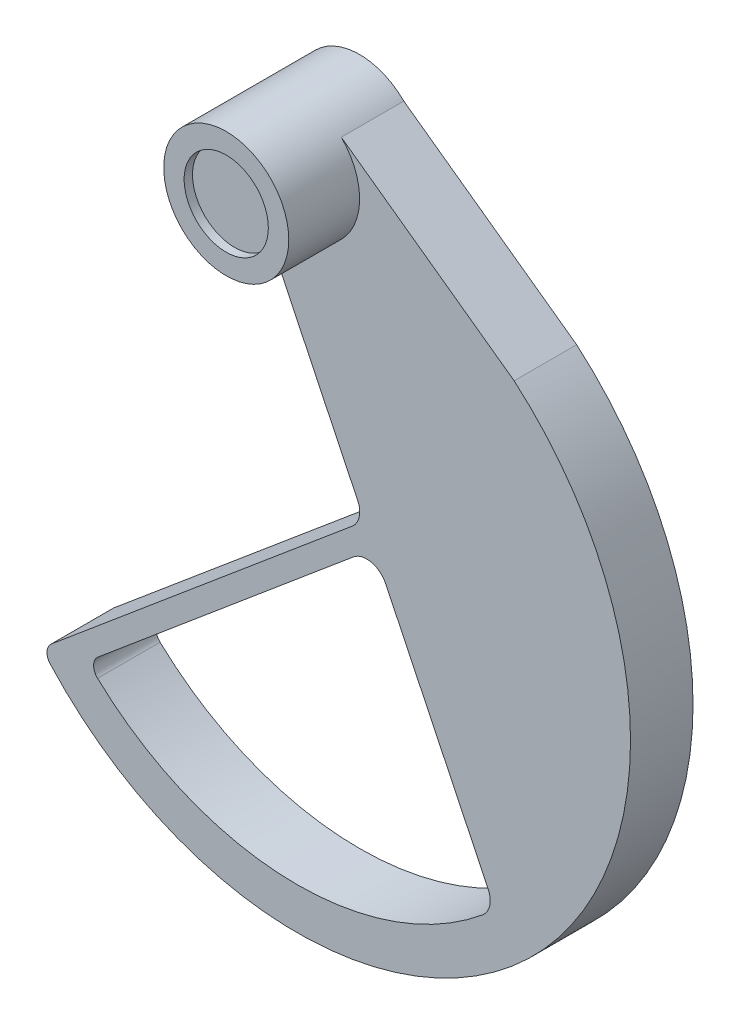
ISO-10303-21;
HEADER;
FILE_DESCRIPTION(('STEP AP214'),'2;1');
FILE_NAME('part.step','',(''),(''),'','','');
FILE_SCHEMA(('AUTOMOTIVE_DESIGN { 1 0 10303 214 1 1 1 1 }'));
ENDSEC;
DATA;
#1=APPLICATION_CONTEXT('core data for automotive mechanical design processes');
#2=APPLICATION_PROTOCOL_DEFINITION('international standard','automotive_design',2000,#1);
#3=PRODUCT_CONTEXT('',#1,'mechanical');
#4=PRODUCT('Part','Part','',(#3));
#5=PRODUCT_RELATED_PRODUCT_CATEGORY('part','',(#4));
#6=PRODUCT_DEFINITION_FORMATION('','',#4);
#7=PRODUCT_DEFINITION_CONTEXT('part definition',#1,'design');
#8=PRODUCT_DEFINITION('design','',#6,#7);
#9=PRODUCT_DEFINITION_SHAPE('','',#8);
#10=(LENGTH_UNIT() NAMED_UNIT(*) SI_UNIT(.MILLI.,.METRE.));
#11=(NAMED_UNIT(*) PLANE_ANGLE_UNIT() SI_UNIT($,.RADIAN.));
#12=(NAMED_UNIT(*) SI_UNIT($,.STERADIAN.) SOLID_ANGLE_UNIT());
#13=UNCERTAINTY_MEASURE_WITH_UNIT(LENGTH_MEASURE(1.E-05),#10,'distance_accuracy_value','');
#14=(GEOMETRIC_REPRESENTATION_CONTEXT(3) GLOBAL_UNCERTAINTY_ASSIGNED_CONTEXT((#13)) GLOBAL_UNIT_ASSIGNED_CONTEXT((#10,
#11,#12)) REPRESENTATION_CONTEXT('',''));
#15=CARTESIAN_POINT('',(0.,0.,0.));
#16=DIRECTION('',(0.,0.,1.));
#17=DIRECTION('',(1.,0.,0.));
#18=AXIS2_PLACEMENT_3D('',#15,#16,#17);
#19=CARTESIAN_POINT('',(-12.7570586950624,-6.1348621133076,15.));
#20=DIRECTION('',(0.901206602628173,0.433389731511241,0.));
#21=DIRECTION('',(-0.433389731511241,0.901206602628173,0.));
#22=AXIS2_PLACEMENT_3D('',#19,#20,#21);
#23=PLANE('',#22);
#24=DIRECTION('',(0.433389731511241,-0.901206602628173,0.));
#25=VECTOR('',#24,1.);
#26=CARTESIAN_POINT('',(-12.7570586950624,-6.1348621133076,0.));
#27=LINE('',#26,#25);
#28=CARTESIAN_POINT('',(21.2324006956412,-76.8137984043253,0.));
#29=VERTEX_POINT('',#28);
#30=CARTESIAN_POINT('',(45.844843506453,-127.9938203457,0.));
#31=VERTEX_POINT('',#30);
#32=EDGE_CURVE('E185',#29,#31,#27,.T.);
#33=ORIENTED_EDGE('',*,*,#32,.T.);
#34=DIRECTION('',(0.,0.,-1.));
#35=VECTOR('',#34,1.);
#36=CARTESIAN_POINT('',(45.844843506453,-127.9938203457,15.));
#37=LINE('',#36,#35);
#38=CARTESIAN_POINT('',(45.844843506453,-127.9938203457,15.));
#39=VERTEX_POINT('',#38);
#40=EDGE_CURVE('E45',#39,#31,#37,.T.);
#41=ORIENTED_EDGE('',*,*,#40,.F.);
#42=DIRECTION('',(0.433389731511241,-0.901206602628173,0.));
#43=VECTOR('',#42,1.);
#44=CARTESIAN_POINT('',(-12.7570586950624,-6.1348621133076,15.));
#45=LINE('',#44,#43);
#46=CARTESIAN_POINT('',(21.2324006956412,-76.8137984043253,15.));
#47=VERTEX_POINT('',#46);
#48=EDGE_CURVE('E228',#47,#39,#45,.T.);
#49=ORIENTED_EDGE('',*,*,#48,.F.);
#50=DIRECTION('',(0.,0.,-1.));
#51=VECTOR('',#50,1.);
#52=CARTESIAN_POINT('',(21.2324006956412,-76.8137984043253,15.));
#53=LINE('',#52,#51);
#54=EDGE_CURVE('E198',#47,#29,#53,.T.);
#55=ORIENTED_EDGE('',*,*,#54,.T.);
#56=EDGE_LOOP('',(#33,#41,#49,#55));
#57=FACE_BOUND('',#56,.T.);
#58=ADVANCED_FACE('F35',(#57),#23,.F.);
#59=CARTESIAN_POINT('',(41.3388104933121,-130.160769003256,15.));
#60=DIRECTION('',(0.,0.,-1.));
#61=DIRECTION('',(-1.,0.,0.));
#62=AXIS2_PLACEMENT_3D('',#59,#60,#61);
#63=CYLINDRICAL_SURFACE('',#62,4.99999999999999);
#64=CARTESIAN_POINT('',(41.3388104933121,-130.160769003256,0.));
#65=DIRECTION('',(0.,0.,1.));
#66=DIRECTION('',(1.,0.,0.));
#67=AXIS2_PLACEMENT_3D('',#64,#65,#66);
#68=CIRCLE('',#67,4.99999999999999);
#69=CARTESIAN_POINT('',(44.5187189927976,-134.019289695814,0.));
#70=VERTEX_POINT('',#69);
#71=EDGE_CURVE('E188',#31,#70,#68,.F.);
#72=ORIENTED_EDGE('',*,*,#71,.T.);
#73=DIRECTION('',(0.,0.,-1.));
#74=VECTOR('',#73,1.);
#75=CARTESIAN_POINT('',(44.5187189927976,-134.019289695814,15.));
#76=LINE('',#75,#74);
#77=CARTESIAN_POINT('',(44.5187189927976,-134.019289695814,15.));
#78=VERTEX_POINT('',#77);
#79=EDGE_CURVE('E202',#78,#70,#76,.T.);
#80=ORIENTED_EDGE('',*,*,#79,.F.);
#81=CARTESIAN_POINT('',(41.3388104933121,-130.160769003256,15.));
#82=DIRECTION('',(0.,0.,1.));
#83=DIRECTION('',(1.,0.,0.));
#84=AXIS2_PLACEMENT_3D('',#81,#82,#83);
#85=CIRCLE('',#84,4.99999999999999);
#86=EDGE_CURVE('E232',#39,#78,#85,.F.);
#87=ORIENTED_EDGE('',*,*,#86,.F.);
#88=ORIENTED_EDGE('',*,*,#40,.T.);
#89=EDGE_LOOP('',(#72,#80,#87,#88));
#90=FACE_BOUND('',#89,.T.);
#91=ADVANCED_FACE('F274',(#90),#63,.F.);
#92=CARTESIAN_POINT('',(0.,-80.,15.));
#93=DIRECTION('',(0.,0.,-1.));
#94=DIRECTION('',(-1.,0.,0.));
#95=AXIS2_PLACEMENT_3D('',#92,#93,#94);
#96=CYLINDRICAL_SURFACE('',#95,70.);
#97=CARTESIAN_POINT('',(0.,-80.,0.));
#98=DIRECTION('',(0.,0.,1.));
#99=DIRECTION('',(1.,0.,0.));
#100=AXIS2_PLACEMENT_3D('',#97,#98,#99);
#101=CIRCLE('',#100,70.);
#102=CARTESIAN_POINT('',(-47.870174388264,-131.072951785042,0.));
#103=VERTEX_POINT('',#102);
#104=EDGE_CURVE('E191',#103,#70,#101,.T.);
#105=ORIENTED_EDGE('',*,*,#104,.F.);
#106=DIRECTION('',(0.,0.,-1.));
#107=VECTOR('',#106,1.);
#108=CARTESIAN_POINT('',(-47.870174388264,-131.072951785042,15.));
#109=LINE('',#108,#107);
#110=CARTESIAN_POINT('',(-47.870174388264,-131.072951785042,15.));
#111=VERTEX_POINT('',#110);
#112=EDGE_CURVE('E155',#111,#103,#109,.T.);
#113=ORIENTED_EDGE('',*,*,#112,.F.);
#114=CARTESIAN_POINT('',(0.,-80.,15.));
#115=DIRECTION('',(0.,0.,1.));
#116=DIRECTION('',(1.,0.,0.));
#117=AXIS2_PLACEMENT_3D('',#114,#115,#116);
#118=CIRCLE('',#117,70.);
#119=EDGE_CURVE('E148',#111,#78,#118,.T.);
#120=ORIENTED_EDGE('',*,*,#119,.T.);
#121=ORIENTED_EDGE('',*,*,#79,.T.);
#122=EDGE_LOOP('',(#105,#113,#120,#121));
#123=FACE_BOUND('',#122,.T.);
#124=ADVANCED_FACE('F251',(#123),#96,.F.);
#125=CARTESIAN_POINT('',(-45.8185954859101,-128.884110994254,15.));
#126=DIRECTION('',(0.,0.,-1.));
#127=DIRECTION('',(-1.,0.,0.));
#128=AXIS2_PLACEMENT_3D('',#125,#126,#127);
#129=CYLINDRICAL_SURFACE('',#128,2.99999999999979);
#130=CARTESIAN_POINT('',(-45.8185954859101,-128.884110994254,0.));
#131=DIRECTION('',(0.,0.,1.));
#132=DIRECTION('',(1.,0.,0.));
#133=AXIS2_PLACEMENT_3D('',#130,#131,#132);
#134=CIRCLE('',#133,2.99999999999979);
#135=CARTESIAN_POINT('',(-47.7476784165524,-126.586582094174,0.));
#136=VERTEX_POINT('',#135);
#137=EDGE_CURVE('E154',#103,#136,#134,.F.);
#138=ORIENTED_EDGE('',*,*,#137,.T.);
#139=DIRECTION('',(0.,0.,-1.));
#140=VECTOR('',#139,1.);
#141=CARTESIAN_POINT('',(-47.7476784165524,-126.586582094174,15.));
#142=LINE('',#141,#140);
#143=CARTESIAN_POINT('',(-47.7476784165524,-126.586582094174,15.));
#144=VERTEX_POINT('',#143);
#145=EDGE_CURVE('E151',#144,#136,#142,.T.);
#146=ORIENTED_EDGE('',*,*,#145,.F.);
#147=CARTESIAN_POINT('',(-45.8185954859101,-128.884110994254,15.));
#148=DIRECTION('',(0.,0.,1.));
#149=DIRECTION('',(1.,0.,0.));
#150=AXIS2_PLACEMENT_3D('',#147,#148,#149);
#151=CIRCLE('',#150,2.99999999999979);
#152=EDGE_CURVE('E142',#111,#144,#151,.F.);
#153=ORIENTED_EDGE('',*,*,#152,.F.);
#154=ORIENTED_EDGE('',*,*,#112,.T.);
#155=EDGE_LOOP('',(#138,#146,#153,#154));
#156=FACE_BOUND('',#155,.T.);
#157=ADVANCED_FACE('F152',(#156),#129,.F.);
#158=CARTESIAN_POINT('',(42.5956727933285,-50.7312504333006,15.));
#159=DIRECTION('',(-0.643027643547508,0.765842966693394,0.));
#160=DIRECTION('',(-0.765842966693394,-0.643027643547508,0.));
#161=AXIS2_PLACEMENT_3D('',#158,#159,#160);
#162=PLANE('',#161);
#163=DIRECTION('',(0.765842966693394,0.643027643547508,0.));
#164=VECTOR('',#163,1.);
#165=CARTESIAN_POINT('',(42.5956727933285,-50.7312504333006,0.));
#166=LINE('',#165,#164);
#167=CARTESIAN_POINT('',(13.5112294647628,-75.1515322284145,0.));
#168=VERTEX_POINT('',#167);
#169=EDGE_CURVE('E99',#136,#168,#166,.T.);
#170=ORIENTED_EDGE('',*,*,#169,.T.);
#171=DIRECTION('',(0.,0.,-1.));
#172=VECTOR('',#171,1.);
#173=CARTESIAN_POINT('',(13.5112294647628,-75.1515322284145,15.));
#174=LINE('',#173,#172);
#175=CARTESIAN_POINT('',(13.5112294647628,-75.1515322284145,15.));
#176=VERTEX_POINT('',#175);
#177=EDGE_CURVE('E156',#176,#168,#174,.T.);
#178=ORIENTED_EDGE('',*,*,#177,.F.);
#179=DIRECTION('',(0.765842966693394,0.643027643547508,0.));
#180=VECTOR('',#179,1.);
#181=CARTESIAN_POINT('',(42.5956727933285,-50.7312504333006,15.));
#182=LINE('',#181,#180);
#183=EDGE_CURVE('E146',#144,#176,#182,.T.);
#184=ORIENTED_EDGE('',*,*,#183,.F.);
#185=ORIENTED_EDGE('',*,*,#145,.T.);
#186=EDGE_LOOP('',(#170,#178,#184,#185));
#187=FACE_BOUND('',#186,.T.);
#188=ADVANCED_FACE('F158',(#187),#162,.F.);
#189=CARTESIAN_POINT('',(10.0302471408598,-65.0565868768263,15.));
#190=DIRECTION('',(0.,0.,-1.));
#191=DIRECTION('',(-1.,0.,0.));
#192=AXIS2_PLACEMENT_3D('',#189,#190,#191);
#193=CYLINDRICAL_SURFACE('',#192,5.);
#194=CARTESIAN_POINT('',(10.0302471408598,-65.0565868768263,0.));
#195=DIRECTION('',(0.,0.,1.));
#196=DIRECTION('',(1.,0.,0.));
#197=AXIS2_PLACEMENT_3D('',#194,#195,#196);
#198=CIRCLE('',#197,5.);
#199=CARTESIAN_POINT('',(13.2441851892925,-68.8868090924212,0.));
#200=VERTEX_POINT('',#199);
#201=CARTESIAN_POINT('',(14.5362801540007,-62.8896382192701,0.));
#202=VERTEX_POINT('',#201);
#203=EDGE_CURVE('E164',#200,#202,#198,.T.);
#204=ORIENTED_EDGE('',*,*,#203,.F.);
#205=DIRECTION('',(0.,0.,-1.));
#206=VECTOR('',#205,1.);
#207=CARTESIAN_POINT('',(13.2441851892925,-68.8868090924212,15.));
#208=LINE('',#207,#206);
#209=CARTESIAN_POINT('',(13.2441851892925,-68.8868090924212,15.));
#210=VERTEX_POINT('',#209);
#211=EDGE_CURVE('E113',#210,#200,#208,.T.);
#212=ORIENTED_EDGE('',*,*,#211,.F.);
#213=CARTESIAN_POINT('',(10.0302471408598,-65.0565868768263,15.));
#214=DIRECTION('',(0.,0.,1.));
#215=DIRECTION('',(1.,0.,0.));
#216=AXIS2_PLACEMENT_3D('',#213,#214,#215);
#217=CIRCLE('',#216,5.);
#218=CARTESIAN_POINT('',(14.5362801540007,-62.8896382192701,15.));
#219=VERTEX_POINT('',#218);
#220=EDGE_CURVE('E197',#210,#219,#217,.T.);
#221=ORIENTED_EDGE('',*,*,#220,.T.);
#222=DIRECTION('',(0.,0.,-1.));
#223=VECTOR('',#222,1.);
#224=CARTESIAN_POINT('',(14.5362801540007,-62.8896382192701,15.));
#225=LINE('',#224,#223);
#226=EDGE_CURVE('E160',#219,#202,#225,.T.);
#227=ORIENTED_EDGE('',*,*,#226,.T.);
#228=EDGE_LOOP('',(#204,#212,#221,#227));
#229=FACE_BOUND('',#228,.T.);
#230=ADVANCED_FACE('F37',(#229),#193,.F.);
#231=CARTESIAN_POINT('',(39.3923101204882,-46.9459271066778,15.));
#232=DIRECTION('',(-0.642787609686534,0.766044443118983,0.));
#233=DIRECTION('',(-0.766044443118982,-0.642787609686534,0.));
#234=AXIS2_PLACEMENT_3D('',#231,#232,#233);
#235=PLANE('',#234);
#236=DIRECTION('',(0.766044443118982,0.642787609686534,0.));
#237=VECTOR('',#236,1.);
#238=CARTESIAN_POINT('',(39.3923101204882,-46.9459271066778,0.));
#239=LINE('',#238,#237);
#240=CARTESIAN_POINT('',(-58.9406362868111,-129.457066169617,0.));
#241=VERTEX_POINT('',#240);
#242=EDGE_CURVE('E167',#241,#200,#239,.T.);
#243=ORIENTED_EDGE('',*,*,#242,.F.);
#244=DIRECTION('',(0.,0.,-1.));
#245=VECTOR('',#244,1.);
#246=CARTESIAN_POINT('',(-58.9406362868111,-129.457066169617,15.));
#247=LINE('',#246,#245);
#248=CARTESIAN_POINT('',(-58.9406362868111,-129.457066169617,15.));
#249=VERTEX_POINT('',#248);
#250=EDGE_CURVE('E213',#249,#241,#247,.T.);
#251=ORIENTED_EDGE('',*,*,#250,.F.);
#252=DIRECTION('',(0.766044443118982,0.642787609686534,0.));
#253=VECTOR('',#252,1.);
#254=CARTESIAN_POINT('',(39.3923101204882,-46.9459271066778,15.));
#255=LINE('',#254,#253);
#256=EDGE_CURVE('E245',#249,#210,#255,.T.);
#257=ORIENTED_EDGE('',*,*,#256,.T.);
#258=ORIENTED_EDGE('',*,*,#211,.T.);
#259=EDGE_LOOP('',(#243,#251,#257,#258));
#260=FACE_BOUND('',#259,.T.);
#261=ADVANCED_FACE('F295',(#260),#235,.T.);
#262=CARTESIAN_POINT('',(-57.0122734577518,-131.755199498973,15.));
#263=DIRECTION('',(0.,0.,-1.));
#264=DIRECTION('',(-1.,0.,0.));
#265=AXIS2_PLACEMENT_3D('',#262,#263,#264);
#266=CYLINDRICAL_SURFACE('',#265,2.99999999999976);
#267=CARTESIAN_POINT('',(-57.0122734577518,-131.755199498973,0.));
#268=DIRECTION('',(0.,0.,1.));
#269=DIRECTION('',(1.,0.,0.));
#270=AXIS2_PLACEMENT_3D('',#267,#268,#269);
#271=CIRCLE('',#270,2.99999999999976);
#272=CARTESIAN_POINT('',(-59.2335308651964,-133.771635843089,0.));
#273=VERTEX_POINT('',#272);
#274=EDGE_CURVE('E171',#273,#241,#271,.F.);
#275=ORIENTED_EDGE('',*,*,#274,.F.);
#276=DIRECTION('',(0.,0.,-1.));
#277=VECTOR('',#276,1.);
#278=CARTESIAN_POINT('',(-59.2335308651964,-133.771635843089,15.));
#279=LINE('',#278,#277);
#280=CARTESIAN_POINT('',(-59.2335308651964,-133.771635843089,15.));
#281=VERTEX_POINT('',#280);
#282=EDGE_CURVE('E210',#281,#273,#279,.T.);
#283=ORIENTED_EDGE('',*,*,#282,.F.);
#284=CARTESIAN_POINT('',(-57.0122734577518,-131.755199498973,15.));
#285=DIRECTION('',(0.,0.,1.));
#286=DIRECTION('',(1.,0.,0.));
#287=AXIS2_PLACEMENT_3D('',#284,#285,#286);
#288=CIRCLE('',#287,2.99999999999976);
#289=EDGE_CURVE('E239',#281,#249,#288,.F.);
#290=ORIENTED_EDGE('',*,*,#289,.T.);
#291=ORIENTED_EDGE('',*,*,#250,.T.);
#292=EDGE_LOOP('',(#275,#283,#290,#291));
#293=FACE_BOUND('',#292,.T.);
#294=ADVANCED_FACE('F292',(#293),#266,.T.);
#295=CARTESIAN_POINT('',(0.,-80.,15.));
#296=DIRECTION('',(0.,0.,-1.));
#297=DIRECTION('',(-1.,0.,0.));
#298=AXIS2_PLACEMENT_3D('',#295,#296,#297);
#299=CYLINDRICAL_SURFACE('',#298,80.);
#300=CARTESIAN_POINT('',(0.,-80.,0.));
#301=DIRECTION('',(0.,0.,1.));
#302=DIRECTION('',(1.,0.,0.));
#303=AXIS2_PLACEMENT_3D('',#300,#301,#302);
#304=CIRCLE('',#303,80.);
#305=CARTESIAN_POINT('',(52.0761789176771,-19.2705047828151,0.));
#306=VERTEX_POINT('',#305);
#307=EDGE_CURVE('E174',#273,#306,#304,.T.);
#308=ORIENTED_EDGE('',*,*,#307,.T.);
#309=DIRECTION('',(0.,0.,-1.));
#310=VECTOR('',#309,1.);
#311=CARTESIAN_POINT('',(52.0761789176771,-19.2705047828151,15.));
#312=LINE('',#311,#310);
#313=CARTESIAN_POINT('',(52.0761789176771,-19.2705047828151,15.));
#314=VERTEX_POINT('',#313);
#315=EDGE_CURVE('E208',#314,#306,#312,.T.);
#316=ORIENTED_EDGE('',*,*,#315,.F.);
#317=CARTESIAN_POINT('',(0.,-80.,15.));
#318=DIRECTION('',(0.,0.,1.));
#319=DIRECTION('',(1.,0.,0.));
#320=AXIS2_PLACEMENT_3D('',#317,#318,#319);
#321=CIRCLE('',#320,80.);
#322=EDGE_CURVE('E235',#281,#314,#321,.T.);
#323=ORIENTED_EDGE('',*,*,#322,.F.);
#324=ORIENTED_EDGE('',*,*,#282,.T.);
#325=EDGE_LOOP('',(#308,#316,#323,#324));
#326=FACE_BOUND('',#325,.T.);
#327=ADVANCED_FACE('F289',(#326),#299,.T.);
#328=CARTESIAN_POINT('',(8.65474635415258,12.0128323695447,15.));
#329=DIRECTION('',(0.584549661802916,0.811357931424902,0.));
#330=DIRECTION('',(-0.811357931424902,0.584549661802916,0.));
#331=AXIS2_PLACEMENT_3D('',#328,#329,#330);
#332=PLANE('',#331);
#333=DIRECTION('',(0.811357931424902,-0.584549661802916,0.));
#334=VECTOR('',#333,1.);
#335=CARTESIAN_POINT('',(8.65474635415258,12.0128323695447,0.));
#336=LINE('',#335,#334);
#337=CARTESIAN_POINT('',(10.6066017177981,10.6066017177983,0.));
#338=VERTEX_POINT('',#337);
#339=EDGE_CURVE('E177',#338,#306,#336,.T.);
#340=ORIENTED_EDGE('',*,*,#339,.F.);
#341=DIRECTION('',(0.,0.,-1.));
#342=VECTOR('',#341,1.);
#343=CARTESIAN_POINT('',(10.6066017177981,10.6066017177983,15.));
#344=LINE('',#343,#342);
#345=CARTESIAN_POINT('',(10.6066017177981,10.6066017177983,15.));
#346=VERTEX_POINT('',#345);
#347=EDGE_CURVE('E211',#346,#338,#344,.T.);
#348=ORIENTED_EDGE('',*,*,#347,.F.);
#349=DIRECTION('',(0.811357931424902,-0.584549661802916,0.));
#350=VECTOR('',#349,1.);
#351=CARTESIAN_POINT('',(8.65474635415258,12.0128323695447,15.));
#352=LINE('',#351,#350);
#353=EDGE_CURVE('E218',#346,#314,#352,.T.);
#354=ORIENTED_EDGE('',*,*,#353,.T.);
#355=ORIENTED_EDGE('',*,*,#315,.T.);
#356=EDGE_LOOP('',(#340,#348,#354,#355));
#357=FACE_BOUND('',#356,.T.);
#358=ADVANCED_FACE('F285',(#357),#332,.T.);
#359=CARTESIAN_POINT('',(0.,0.,15.));
#360=DIRECTION('',(0.,0.,-1.));
#361=DIRECTION('',(-1.,0.,0.));
#362=AXIS2_PLACEMENT_3D('',#359,#360,#361);
#363=CYLINDRICAL_SURFACE('',#362,15.);
#364=CARTESIAN_POINT('',(0.,0.,0.));
#365=DIRECTION('',(0.,0.,1.));
#366=DIRECTION('',(1.,0.,0.));
#367=AXIS2_PLACEMENT_3D('',#364,#365,#366);
#368=CIRCLE('',#367,15.);
#369=CARTESIAN_POINT('',(-10.6066017177981,-10.6066017177983,0.));
#370=VERTEX_POINT('',#369);
#371=EDGE_CURVE('E180',#338,#370,#368,.T.);
#372=ORIENTED_EDGE('',*,*,#371,.T.);
#373=DIRECTION('',(0.,0.,-1.));
#374=VECTOR('',#373,1.);
#375=CARTESIAN_POINT('',(-10.6066017177981,-10.6066017177983,15.));
#376=LINE('',#375,#374);
#377=CARTESIAN_POINT('',(-10.6066017177981,-10.6066017177983,15.));
#378=VERTEX_POINT('',#377);
#379=EDGE_CURVE('E207',#378,#370,#376,.T.);
#380=ORIENTED_EDGE('',*,*,#379,.F.);
#381=CARTESIAN_POINT('',(0.,0.,15.));
#382=DIRECTION('',(0.,0.,1.));
#383=DIRECTION('',(1.,0.,0.));
#384=AXIS2_PLACEMENT_3D('',#381,#382,#383);
#385=CIRCLE('',#384,15.);
#386=EDGE_CURVE('E11',#378,#346,#385,.T.);
#387=ORIENTED_EDGE('',*,*,#386,.T.);
#388=ORIENTED_EDGE('',*,*,#347,.T.);
#389=EDGE_LOOP('',(#372,#380,#387,#388));
#390=FACE_BOUND('',#389,.T.);
#391=CARTESIAN_POINT('',(0.,0.,32.));
#392=DIRECTION('',(0.,0.,1.));
#393=DIRECTION('',(1.,0.,0.));
#394=AXIS2_PLACEMENT_3D('',#391,#392,#393);
#395=CIRCLE('',#394,15.);
#396=CARTESIAN_POINT('',(15.,0.,32.));
#397=VERTEX_POINT('',#396);
#398=EDGE_CURVE('E168',#397,#397,#395,.T.);
#399=ORIENTED_EDGE('',*,*,#398,.F.);
#400=EDGE_LOOP('',(#399));
#401=FACE_BOUND('',#400,.T.);
#402=ADVANCED_FACE('F268',(#390,#401),#363,.T.);
#403=CARTESIAN_POINT('',(-12.7570586950624,-6.13486211330761,15.));
#404=DIRECTION('',(0.901206602628173,0.433389731511242,0.));
#405=DIRECTION('',(-0.433389731511242,0.901206602628173,0.));
#406=AXIS2_PLACEMENT_3D('',#403,#404,#405);
#407=PLANE('',#406);
#408=DIRECTION('',(0.433389731511242,-0.901206602628173,0.));
#409=VECTOR('',#408,1.);
#410=CARTESIAN_POINT('',(-12.7570586950624,-6.13486211330761,0.));
#411=LINE('',#410,#409);
#412=EDGE_CURVE('E182',#370,#202,#411,.T.);
#413=ORIENTED_EDGE('',*,*,#412,.T.);
#414=ORIENTED_EDGE('',*,*,#226,.F.);
#415=DIRECTION('',(0.433389731511242,-0.901206602628173,0.));
#416=VECTOR('',#415,1.);
#417=CARTESIAN_POINT('',(-12.7570586950624,-6.13486211330761,15.));
#418=LINE('',#417,#416);
#419=EDGE_CURVE('E227',#378,#219,#418,.T.);
#420=ORIENTED_EDGE('',*,*,#419,.F.);
#421=ORIENTED_EDGE('',*,*,#379,.T.);
#422=EDGE_LOOP('',(#413,#414,#420,#421));
#423=FACE_BOUND('',#422,.T.);
#424=ADVANCED_FACE('F261',(#423),#407,.F.);
#425=CARTESIAN_POINT('',(16.7263676825004,-78.9807470618814,15.));
#426=DIRECTION('',(0.,0.,-1.));
#427=DIRECTION('',(-1.,0.,0.));
#428=AXIS2_PLACEMENT_3D('',#425,#426,#427);
#429=CYLINDRICAL_SURFACE('',#428,5.);
#430=CARTESIAN_POINT('',(16.7263676825004,-78.9807470618814,0.));
#431=DIRECTION('',(0.,0.,1.));
#432=DIRECTION('',(1.,0.,0.));
#433=AXIS2_PLACEMENT_3D('',#430,#431,#432);
#434=CIRCLE('',#433,5.);
#435=EDGE_CURVE('E105',#168,#29,#434,.F.);
#436=ORIENTED_EDGE('',*,*,#435,.T.);
#437=ORIENTED_EDGE('',*,*,#54,.F.);
#438=CARTESIAN_POINT('',(16.7263676825004,-78.9807470618814,15.));
#439=DIRECTION('',(0.,0.,1.));
#440=DIRECTION('',(1.,0.,0.));
#441=AXIS2_PLACEMENT_3D('',#438,#439,#440);
#442=CIRCLE('',#441,5.);
#443=EDGE_CURVE('E54',#176,#47,#442,.F.);
#444=ORIENTED_EDGE('',*,*,#443,.F.);
#445=ORIENTED_EDGE('',*,*,#177,.T.);
#446=EDGE_LOOP('',(#436,#437,#444,#445));
#447=FACE_BOUND('',#446,.T.);
#448=ADVANCED_FACE('F259',(#447),#429,.F.);
#449=CARTESIAN_POINT('',(0.,0.,15.));
#450=DIRECTION('',(0.,0.,1.));
#451=DIRECTION('',(1.,0.,0.));
#452=AXIS2_PLACEMENT_3D('',#449,#450,#451);
#453=PLANE('',#452);
#454=ORIENTED_EDGE('',*,*,#386,.F.);
#455=ORIENTED_EDGE('',*,*,#419,.T.);
#456=ORIENTED_EDGE('',*,*,#220,.F.);
#457=ORIENTED_EDGE('',*,*,#256,.F.);
#458=ORIENTED_EDGE('',*,*,#289,.F.);
#459=ORIENTED_EDGE('',*,*,#322,.T.);
#460=ORIENTED_EDGE('',*,*,#353,.F.);
#461=EDGE_LOOP('',(#454,#455,#456,#457,#458,#459,#460));
#462=FACE_BOUND('',#461,.T.);
#463=ORIENTED_EDGE('',*,*,#48,.T.);
#464=ORIENTED_EDGE('',*,*,#86,.T.);
#465=ORIENTED_EDGE('',*,*,#119,.F.);
#466=ORIENTED_EDGE('',*,*,#152,.T.);
#467=ORIENTED_EDGE('',*,*,#183,.T.);
#468=ORIENTED_EDGE('',*,*,#443,.T.);
#469=EDGE_LOOP('',(#463,#464,#465,#466,#467,#468));
#470=FACE_BOUND('',#469,.T.);
#471=ADVANCED_FACE('F144',(#462,#470),#453,.T.);
#472=CARTESIAN_POINT('',(0.,0.,0.));
#473=DIRECTION('',(0.,0.,1.));
#474=DIRECTION('',(1.,0.,0.));
#475=AXIS2_PLACEMENT_3D('',#472,#473,#474);
#476=PLANE('',#475);
#477=ORIENTED_EDGE('',*,*,#203,.T.);
#478=ORIENTED_EDGE('',*,*,#412,.F.);
#479=ORIENTED_EDGE('',*,*,#371,.F.);
#480=ORIENTED_EDGE('',*,*,#339,.T.);
#481=ORIENTED_EDGE('',*,*,#307,.F.);
#482=ORIENTED_EDGE('',*,*,#274,.T.);
#483=ORIENTED_EDGE('',*,*,#242,.T.);
#484=EDGE_LOOP('',(#477,#478,#479,#480,#481,#482,#483));
#485=FACE_BOUND('',#484,.T.);
#486=ORIENTED_EDGE('',*,*,#32,.F.);
#487=ORIENTED_EDGE('',*,*,#435,.F.);
#488=ORIENTED_EDGE('',*,*,#169,.F.);
#489=ORIENTED_EDGE('',*,*,#137,.F.);
#490=ORIENTED_EDGE('',*,*,#104,.T.);
#491=ORIENTED_EDGE('',*,*,#71,.F.);
#492=EDGE_LOOP('',(#486,#487,#488,#489,#490,#491));
#493=FACE_BOUND('',#492,.T.);
#494=ADVANCED_FACE('F255',(#485,#493),#476,.F.);
#495=CARTESIAN_POINT('',(0.,0.,32.));
#496=DIRECTION('',(0.,0.,1.));
#497=DIRECTION('',(1.,0.,0.));
#498=AXIS2_PLACEMENT_3D('',#495,#496,#497);
#499=PLANE('',#498);
#500=CARTESIAN_POINT('',(0.,0.,32.));
#501=DIRECTION('',(0.,0.,1.));
#502=DIRECTION('',(1.,0.,0.));
#503=AXIS2_PLACEMENT_3D('',#500,#501,#502);
#504=CIRCLE('',#503,10.1);
#505=CARTESIAN_POINT('',(10.1,0.,32.));
#506=VERTEX_POINT('',#505);
#507=EDGE_CURVE('E313',#506,#506,#504,.T.);
#508=ORIENTED_EDGE('',*,*,#507,.F.);
#509=EDGE_LOOP('',(#508));
#510=FACE_BOUND('',#509,.T.);
#511=ORIENTED_EDGE('',*,*,#398,.T.);
#512=EDGE_LOOP('',(#511));
#513=FACE_BOUND('',#512,.T.);
#514=ADVANCED_FACE('F324',(#510,#513),#499,.T.);
#515=CARTESIAN_POINT('',(0.,0.,30.));
#516=DIRECTION('',(0.,0.,1.));
#517=DIRECTION('',(1.,0.,0.));
#518=AXIS2_PLACEMENT_3D('',#515,#516,#517);
#519=CYLINDRICAL_SURFACE('',#518,10.1);
#520=CARTESIAN_POINT('',(0.,0.,30.));
#521=DIRECTION('',(0.,0.,1.));
#522=DIRECTION('',(1.,0.,0.));
#523=AXIS2_PLACEMENT_3D('',#520,#521,#522);
#524=CIRCLE('',#523,10.1);
#525=CARTESIAN_POINT('',(10.1,0.,30.));
#526=VERTEX_POINT('',#525);
#527=EDGE_CURVE('E312',#526,#526,#524,.T.);
#528=ORIENTED_EDGE('',*,*,#527,.F.);
#529=EDGE_LOOP('',(#528));
#530=FACE_BOUND('',#529,.T.);
#531=ORIENTED_EDGE('',*,*,#507,.T.);
#532=EDGE_LOOP('',(#531));
#533=FACE_BOUND('',#532,.T.);
#534=ADVANCED_FACE('F321',(#530,#533),#519,.F.);
#535=CARTESIAN_POINT('',(0.,0.,30.));
#536=DIRECTION('',(0.,0.,1.));
#537=DIRECTION('',(1.,0.,0.));
#538=AXIS2_PLACEMENT_3D('',#535,#536,#537);
#539=PLANE('',#538);
#540=ORIENTED_EDGE('',*,*,#527,.T.);
#541=EDGE_LOOP('',(#540));
#542=FACE_BOUND('',#541,.T.);
#543=ADVANCED_FACE('F319',(#542),#539,.T.);
#544=CLOSED_SHELL('',(#58,#91,#124,#157,#188,#230,#261,#294,#327,#358,#402,#424,#448,#471,#494,
#514,#534,#543));
#545=MANIFOLD_SOLID_BREP('B2',#544);
#546=ADVANCED_BREP_SHAPE_REPRESENTATION('',(#18,#545),#14);
#547=SHAPE_DEFINITION_REPRESENTATION(#9,#546);
ENDSEC;
END-ISO-10303-21;
